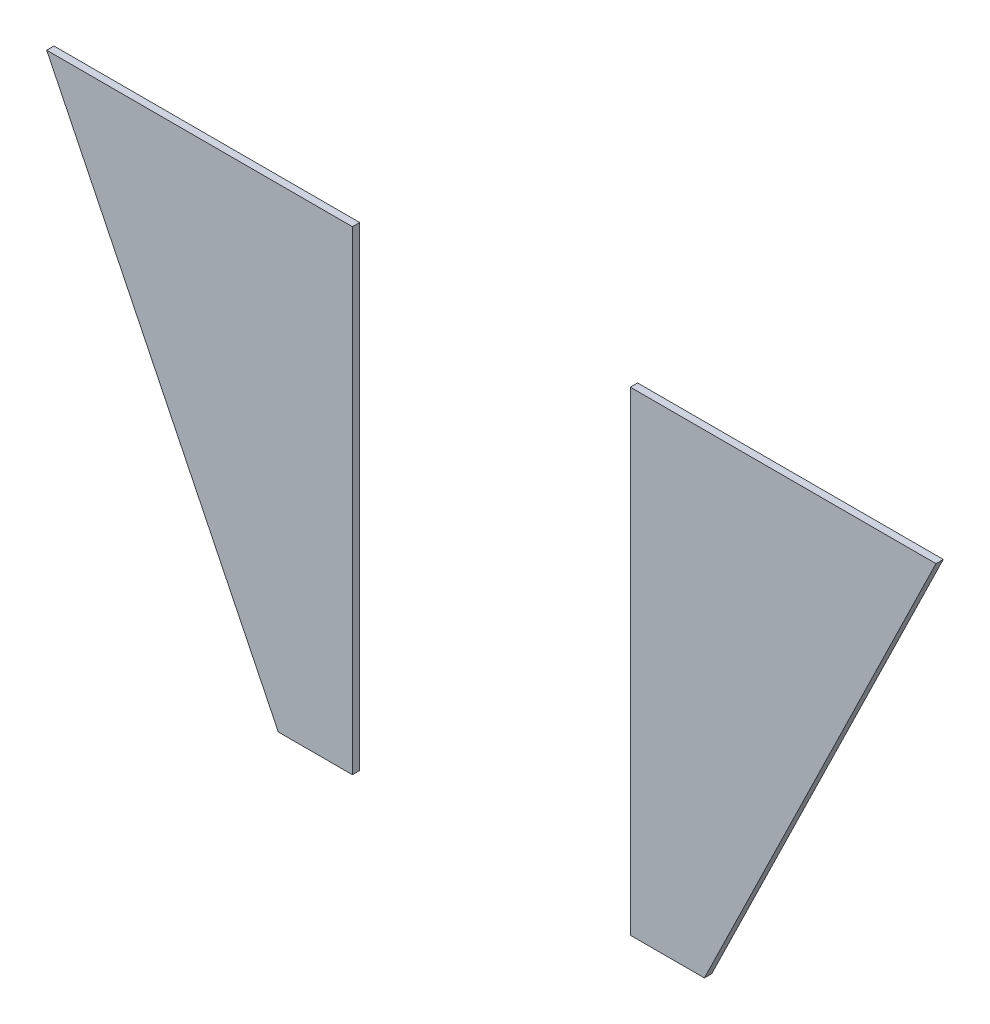
ISO-10303-21;
HEADER;
FILE_DESCRIPTION(('STEP AP214'),'2;1');
FILE_NAME('part.step','',(''),(''),'','','');
FILE_SCHEMA(('AUTOMOTIVE_DESIGN { 1 0 10303 214 1 1 1 1 }'));
ENDSEC;
DATA;
#1=APPLICATION_CONTEXT('core data for automotive mechanical design processes');
#2=APPLICATION_PROTOCOL_DEFINITION('international standard','automotive_design',2000,#1);
#3=PRODUCT_CONTEXT('',#1,'mechanical');
#4=PRODUCT('Part','Part','',(#3));
#5=PRODUCT_RELATED_PRODUCT_CATEGORY('part','',(#4));
#6=PRODUCT_DEFINITION_FORMATION('','',#4);
#7=PRODUCT_DEFINITION_CONTEXT('part definition',#1,'design');
#8=PRODUCT_DEFINITION('design','',#6,#7);
#9=PRODUCT_DEFINITION_SHAPE('','',#8);
#10=(LENGTH_UNIT() NAMED_UNIT(*) SI_UNIT(.MILLI.,.METRE.));
#11=(NAMED_UNIT(*) PLANE_ANGLE_UNIT() SI_UNIT($,.RADIAN.));
#12=(NAMED_UNIT(*) SI_UNIT($,.STERADIAN.) SOLID_ANGLE_UNIT());
#13=UNCERTAINTY_MEASURE_WITH_UNIT(LENGTH_MEASURE(1.E-05),#10,'distance_accuracy_value','');
#14=(GEOMETRIC_REPRESENTATION_CONTEXT(3) GLOBAL_UNCERTAINTY_ASSIGNED_CONTEXT((#13)) GLOBAL_UNIT_ASSIGNED_CONTEXT((#10,
#11,#12)) REPRESENTATION_CONTEXT('',''));
#15=CARTESIAN_POINT('',(0.,0.,0.));
#16=DIRECTION('',(0.,0.,1.));
#17=DIRECTION('',(1.,0.,0.));
#18=AXIS2_PLACEMENT_3D('',#15,#16,#17);
#19=CARTESIAN_POINT('',(92.9427180443167,2.88597765364185,5.));
#20=DIRECTION('',(0.89873260456614,0.438497098610427,0.));
#21=DIRECTION('',(-0.438497098610427,0.89873260456614,0.));
#22=AXIS2_PLACEMENT_3D('',#19,#20,#21);
#23=PLANE('',#22);
#24=DIRECTION('',(0.438497098610427,-0.89873260456614,0.));
#25=VECTOR('',#24,1.);
#26=CARTESIAN_POINT('',(92.9427180443167,2.88597765364185,0.));
#27=LINE('',#26,#25);
#28=CARTESIAN_POINT('',(-65.8072819556834,328.255977653642,0.));
#29=VERTEX_POINT('',#28);
#30=CARTESIAN_POINT('',(92.9427180443167,2.88597765364185,0.));
#31=VERTEX_POINT('',#30);
#32=EDGE_CURVE('E106',#29,#31,#27,.T.);
#33=ORIENTED_EDGE('',*,*,#32,.T.);
#34=DIRECTION('',(0.,0.,-1.));
#35=VECTOR('',#34,1.);
#36=CARTESIAN_POINT('',(92.9427180443167,2.88597765364185,5.));
#37=LINE('',#36,#35);
#38=CARTESIAN_POINT('',(92.9427180443167,2.88597765364185,5.));
#39=VERTEX_POINT('',#38);
#40=EDGE_CURVE('E12',#39,#31,#37,.T.);
#41=ORIENTED_EDGE('',*,*,#40,.F.);
#42=DIRECTION('',(0.438497098610427,-0.89873260456614,0.));
#43=VECTOR('',#42,1.);
#44=CARTESIAN_POINT('',(92.9427180443167,2.88597765364185,5.));
#45=LINE('',#44,#43);
#46=CARTESIAN_POINT('',(-65.8072819556834,328.255977653642,5.));
#47=VERTEX_POINT('',#46);
#48=EDGE_CURVE('E94',#47,#39,#45,.T.);
#49=ORIENTED_EDGE('',*,*,#48,.F.);
#50=DIRECTION('',(0.,0.,-1.));
#51=VECTOR('',#50,1.);
#52=CARTESIAN_POINT('',(-65.8072819556834,328.255977653642,5.));
#53=LINE('',#52,#51);
#54=EDGE_CURVE('E102',#47,#29,#53,.T.);
#55=ORIENTED_EDGE('',*,*,#54,.T.);
#56=EDGE_LOOP('',(#33,#41,#49,#55));
#57=FACE_BOUND('',#56,.T.);
#58=ADVANCED_FACE('F43',(#57),#23,.F.);
#59=CARTESIAN_POINT('',(92.9427180443167,2.88597765364185,5.));
#60=DIRECTION('',(0.,1.,0.));
#61=DIRECTION('',(0.,0.,1.));
#62=AXIS2_PLACEMENT_3D('',#59,#60,#61);
#63=PLANE('',#62);
#64=DIRECTION('',(1.,0.,0.));
#65=VECTOR('',#64,1.);
#66=CARTESIAN_POINT('',(92.9427180443167,2.88597765364185,0.));
#67=LINE('',#66,#65);
#68=CARTESIAN_POINT('',(143.742718044317,2.88597765364185,0.));
#69=VERTEX_POINT('',#68);
#70=EDGE_CURVE('E98',#31,#69,#67,.T.);
#71=ORIENTED_EDGE('',*,*,#70,.T.);
#72=DIRECTION('',(0.,0.,-1.));
#73=VECTOR('',#72,1.);
#74=CARTESIAN_POINT('',(143.742718044317,2.88597765364185,5.));
#75=LINE('',#74,#73);
#76=CARTESIAN_POINT('',(143.742718044317,2.88597765364185,5.));
#77=VERTEX_POINT('',#76);
#78=EDGE_CURVE('E51',#77,#69,#75,.T.);
#79=ORIENTED_EDGE('',*,*,#78,.F.);
#80=DIRECTION('',(1.,0.,0.));
#81=VECTOR('',#80,1.);
#82=CARTESIAN_POINT('',(92.9427180443167,2.88597765364185,5.));
#83=LINE('',#82,#81);
#84=EDGE_CURVE('E89',#39,#77,#83,.T.);
#85=ORIENTED_EDGE('',*,*,#84,.F.);
#86=ORIENTED_EDGE('',*,*,#40,.T.);
#87=EDGE_LOOP('',(#71,#79,#85,#86));
#88=FACE_BOUND('',#87,.T.);
#89=ADVANCED_FACE('F97',(#88),#63,.F.);
#90=CARTESIAN_POINT('',(143.742718044317,328.255977653642,5.));
#91=DIRECTION('',(-1.,0.,0.));
#92=DIRECTION('',(0.,-1.,0.));
#93=AXIS2_PLACEMENT_3D('',#90,#91,#92);
#94=PLANE('',#93);
#95=DIRECTION('',(0.,1.,0.));
#96=VECTOR('',#95,1.);
#97=CARTESIAN_POINT('',(143.742718044317,328.255977653642,0.));
#98=LINE('',#97,#96);
#99=CARTESIAN_POINT('',(143.742718044317,328.255977653642,0.));
#100=VERTEX_POINT('',#99);
#101=EDGE_CURVE('E76',#69,#100,#98,.T.);
#102=ORIENTED_EDGE('',*,*,#101,.T.);
#103=DIRECTION('',(0.,0.,-1.));
#104=VECTOR('',#103,1.);
#105=CARTESIAN_POINT('',(143.742718044317,328.255977653642,5.));
#106=LINE('',#105,#104);
#107=CARTESIAN_POINT('',(143.742718044317,328.255977653642,5.));
#108=VERTEX_POINT('',#107);
#109=EDGE_CURVE('E99',#108,#100,#106,.T.);
#110=ORIENTED_EDGE('',*,*,#109,.F.);
#111=DIRECTION('',(0.,1.,0.));
#112=VECTOR('',#111,1.);
#113=CARTESIAN_POINT('',(143.742718044317,328.255977653642,5.));
#114=LINE('',#113,#112);
#115=EDGE_CURVE('E92',#77,#108,#114,.T.);
#116=ORIENTED_EDGE('',*,*,#115,.F.);
#117=ORIENTED_EDGE('',*,*,#78,.T.);
#118=EDGE_LOOP('',(#102,#110,#116,#117));
#119=FACE_BOUND('',#118,.T.);
#120=ADVANCED_FACE('F100',(#119),#94,.F.);
#121=CARTESIAN_POINT('',(-65.8072819556834,328.255977653642,5.));
#122=DIRECTION('',(0.,-1.,0.));
#123=DIRECTION('',(0.,0.,-1.));
#124=AXIS2_PLACEMENT_3D('',#121,#122,#123);
#125=PLANE('',#124);
#126=DIRECTION('',(-1.,0.,0.));
#127=VECTOR('',#126,1.);
#128=CARTESIAN_POINT('',(-65.8072819556834,328.255977653642,0.));
#129=LINE('',#128,#127);
#130=EDGE_CURVE('E82',#100,#29,#129,.T.);
#131=ORIENTED_EDGE('',*,*,#130,.T.);
#132=ORIENTED_EDGE('',*,*,#54,.F.);
#133=DIRECTION('',(-1.,0.,0.));
#134=VECTOR('',#133,1.);
#135=CARTESIAN_POINT('',(-65.8072819556834,328.255977653642,5.));
#136=LINE('',#135,#134);
#137=EDGE_CURVE('E59',#108,#47,#136,.T.);
#138=ORIENTED_EDGE('',*,*,#137,.F.);
#139=ORIENTED_EDGE('',*,*,#109,.T.);
#140=EDGE_LOOP('',(#131,#132,#138,#139));
#141=FACE_BOUND('',#140,.T.);
#142=ADVANCED_FACE('F113',(#141),#125,.F.);
#143=CARTESIAN_POINT('',(0.,0.,5.));
#144=DIRECTION('',(0.,0.,-1.));
#145=DIRECTION('',(-1.,0.,0.));
#146=AXIS2_PLACEMENT_3D('',#143,#144,#145);
#147=PLANE('',#146);
#148=ORIENTED_EDGE('',*,*,#48,.T.);
#149=ORIENTED_EDGE('',*,*,#84,.T.);
#150=ORIENTED_EDGE('',*,*,#115,.T.);
#151=ORIENTED_EDGE('',*,*,#137,.T.);
#152=EDGE_LOOP('',(#148,#149,#150,#151));
#153=FACE_BOUND('',#152,.T.);
#154=ADVANCED_FACE('F90',(#153),#147,.F.);
#155=CARTESIAN_POINT('',(0.,0.,0.));
#156=DIRECTION('',(0.,0.,-1.));
#157=DIRECTION('',(-1.,0.,0.));
#158=AXIS2_PLACEMENT_3D('',#155,#156,#157);
#159=PLANE('',#158);
#160=ORIENTED_EDGE('',*,*,#32,.F.);
#161=ORIENTED_EDGE('',*,*,#130,.F.);
#162=ORIENTED_EDGE('',*,*,#101,.F.);
#163=ORIENTED_EDGE('',*,*,#70,.F.);
#164=EDGE_LOOP('',(#160,#161,#162,#163));
#165=FACE_BOUND('',#164,.T.);
#166=ADVANCED_FACE('F116',(#165),#159,.T.);
#167=CLOSED_SHELL('',(#58,#89,#120,#142,#154,#166));
#168=MANIFOLD_SOLID_BREP('B2',#167);
#169=CARTESIAN_POINT('',(543.792718044317,328.255977653642,5.));
#170=DIRECTION('',(0.,-1.,0.));
#171=DIRECTION('',(0.,0.,-1.));
#172=AXIS2_PLACEMENT_3D('',#169,#170,#171);
#173=PLANE('',#172);
#174=DIRECTION('',(-1.,0.,0.));
#175=VECTOR('',#174,1.);
#176=CARTESIAN_POINT('',(543.792718044317,328.255977653642,0.));
#177=LINE('',#176,#175);
#178=CARTESIAN_POINT('',(543.792718044317,328.255977653642,0.));
#179=VERTEX_POINT('',#178);
#180=CARTESIAN_POINT('',(334.242718044317,328.255977653642,0.));
#181=VERTEX_POINT('',#180);
#182=EDGE_CURVE('E230',#179,#181,#177,.T.);
#183=ORIENTED_EDGE('',*,*,#182,.T.);
#184=DIRECTION('',(0.,0.,-1.));
#185=VECTOR('',#184,1.);
#186=CARTESIAN_POINT('',(334.242718044317,328.255977653642,5.));
#187=LINE('',#186,#185);
#188=CARTESIAN_POINT('',(334.242718044317,328.255977653642,5.));
#189=VERTEX_POINT('',#188);
#190=EDGE_CURVE('E41',#189,#181,#187,.T.);
#191=ORIENTED_EDGE('',*,*,#190,.F.);
#192=DIRECTION('',(-1.,0.,0.));
#193=VECTOR('',#192,1.);
#194=CARTESIAN_POINT('',(543.792718044317,328.255977653642,5.));
#195=LINE('',#194,#193);
#196=CARTESIAN_POINT('',(543.792718044317,328.255977653642,5.));
#197=VERTEX_POINT('',#196);
#198=EDGE_CURVE('E218',#197,#189,#195,.T.);
#199=ORIENTED_EDGE('',*,*,#198,.F.);
#200=DIRECTION('',(0.,0.,-1.));
#201=VECTOR('',#200,1.);
#202=CARTESIAN_POINT('',(543.792718044317,328.255977653642,5.));
#203=LINE('',#202,#201);
#204=EDGE_CURVE('E226',#197,#179,#203,.T.);
#205=ORIENTED_EDGE('',*,*,#204,.T.);
#206=EDGE_LOOP('',(#183,#191,#199,#205));
#207=FACE_BOUND('',#206,.T.);
#208=ADVANCED_FACE('F167',(#207),#173,.F.);
#209=CARTESIAN_POINT('',(334.242718044317,328.255977653642,5.));
#210=DIRECTION('',(1.,0.,0.));
#211=DIRECTION('',(0.,1.,0.));
#212=AXIS2_PLACEMENT_3D('',#209,#210,#211);
#213=PLANE('',#212);
#214=DIRECTION('',(0.,-1.,0.));
#215=VECTOR('',#214,1.);
#216=CARTESIAN_POINT('',(334.242718044317,328.255977653642,0.));
#217=LINE('',#216,#215);
#218=CARTESIAN_POINT('',(334.242718044317,2.88597765364185,0.));
#219=VERTEX_POINT('',#218);
#220=EDGE_CURVE('E222',#181,#219,#217,.T.);
#221=ORIENTED_EDGE('',*,*,#220,.T.);
#222=DIRECTION('',(0.,0.,-1.));
#223=VECTOR('',#222,1.);
#224=CARTESIAN_POINT('',(334.242718044317,2.88597765364185,5.));
#225=LINE('',#224,#223);
#226=CARTESIAN_POINT('',(334.242718044317,2.88597765364185,5.));
#227=VERTEX_POINT('',#226);
#228=EDGE_CURVE('E175',#227,#219,#225,.T.);
#229=ORIENTED_EDGE('',*,*,#228,.F.);
#230=DIRECTION('',(0.,-1.,0.));
#231=VECTOR('',#230,1.);
#232=CARTESIAN_POINT('',(334.242718044317,328.255977653642,5.));
#233=LINE('',#232,#231);
#234=EDGE_CURVE('E213',#189,#227,#233,.T.);
#235=ORIENTED_EDGE('',*,*,#234,.F.);
#236=ORIENTED_EDGE('',*,*,#190,.T.);
#237=EDGE_LOOP('',(#221,#229,#235,#236));
#238=FACE_BOUND('',#237,.T.);
#239=ADVANCED_FACE('F221',(#238),#213,.F.);
#240=CARTESIAN_POINT('',(385.042718044317,2.88597765364185,5.));
#241=DIRECTION('',(0.,1.,0.));
#242=DIRECTION('',(0.,0.,1.));
#243=AXIS2_PLACEMENT_3D('',#240,#241,#242);
#244=PLANE('',#243);
#245=DIRECTION('',(1.,0.,0.));
#246=VECTOR('',#245,1.);
#247=CARTESIAN_POINT('',(385.042718044317,2.88597765364185,0.));
#248=LINE('',#247,#246);
#249=CARTESIAN_POINT('',(385.042718044317,2.88597765364185,0.));
#250=VERTEX_POINT('',#249);
#251=EDGE_CURVE('E200',#219,#250,#248,.T.);
#252=ORIENTED_EDGE('',*,*,#251,.T.);
#253=DIRECTION('',(0.,0.,-1.));
#254=VECTOR('',#253,1.);
#255=CARTESIAN_POINT('',(385.042718044317,2.88597765364185,5.));
#256=LINE('',#255,#254);
#257=CARTESIAN_POINT('',(385.042718044317,2.88597765364185,5.));
#258=VERTEX_POINT('',#257);
#259=EDGE_CURVE('E223',#258,#250,#256,.T.);
#260=ORIENTED_EDGE('',*,*,#259,.F.);
#261=DIRECTION('',(1.,0.,0.));
#262=VECTOR('',#261,1.);
#263=CARTESIAN_POINT('',(385.042718044317,2.88597765364185,5.));
#264=LINE('',#263,#262);
#265=EDGE_CURVE('E216',#227,#258,#264,.T.);
#266=ORIENTED_EDGE('',*,*,#265,.F.);
#267=ORIENTED_EDGE('',*,*,#228,.T.);
#268=EDGE_LOOP('',(#252,#260,#266,#267));
#269=FACE_BOUND('',#268,.T.);
#270=ADVANCED_FACE('F224',(#269),#244,.F.);
#271=CARTESIAN_POINT('',(385.042718044317,2.88597765364185,5.));
#272=DIRECTION('',(-0.89873260456614,0.438497098610427,0.));
#273=DIRECTION('',(-0.438497098610427,-0.89873260456614,0.));
#274=AXIS2_PLACEMENT_3D('',#271,#272,#273);
#275=PLANE('',#274);
#276=DIRECTION('',(0.438497098610427,0.89873260456614,0.));
#277=VECTOR('',#276,1.);
#278=CARTESIAN_POINT('',(385.042718044317,2.88597765364185,0.));
#279=LINE('',#278,#277);
#280=EDGE_CURVE('E206',#250,#179,#279,.T.);
#281=ORIENTED_EDGE('',*,*,#280,.T.);
#282=ORIENTED_EDGE('',*,*,#204,.F.);
#283=DIRECTION('',(0.438497098610427,0.89873260456614,0.));
#284=VECTOR('',#283,1.);
#285=CARTESIAN_POINT('',(385.042718044317,2.88597765364185,5.));
#286=LINE('',#285,#284);
#287=EDGE_CURVE('E183',#258,#197,#286,.T.);
#288=ORIENTED_EDGE('',*,*,#287,.F.);
#289=ORIENTED_EDGE('',*,*,#259,.T.);
#290=EDGE_LOOP('',(#281,#282,#288,#289));
#291=FACE_BOUND('',#290,.T.);
#292=ADVANCED_FACE('F237',(#291),#275,.F.);
#293=CARTESIAN_POINT('',(0.,0.,5.));
#294=DIRECTION('',(0.,0.,1.));
#295=DIRECTION('',(1.,0.,0.));
#296=AXIS2_PLACEMENT_3D('',#293,#294,#295);
#297=PLANE('',#296);
#298=ORIENTED_EDGE('',*,*,#198,.T.);
#299=ORIENTED_EDGE('',*,*,#234,.T.);
#300=ORIENTED_EDGE('',*,*,#265,.T.);
#301=ORIENTED_EDGE('',*,*,#287,.T.);
#302=EDGE_LOOP('',(#298,#299,#300,#301));
#303=FACE_BOUND('',#302,.T.);
#304=ADVANCED_FACE('F214',(#303),#297,.T.);
#305=CARTESIAN_POINT('',(0.,0.,0.));
#306=DIRECTION('',(0.,0.,1.));
#307=DIRECTION('',(1.,0.,0.));
#308=AXIS2_PLACEMENT_3D('',#305,#306,#307);
#309=PLANE('',#308);
#310=ORIENTED_EDGE('',*,*,#182,.F.);
#311=ORIENTED_EDGE('',*,*,#280,.F.);
#312=ORIENTED_EDGE('',*,*,#251,.F.);
#313=ORIENTED_EDGE('',*,*,#220,.F.);
#314=EDGE_LOOP('',(#310,#311,#312,#313));
#315=FACE_BOUND('',#314,.T.);
#316=ADVANCED_FACE('F240',(#315),#309,.F.);
#317=CLOSED_SHELL('',(#208,#239,#270,#292,#304,#316));
#318=MANIFOLD_SOLID_BREP('B6',#317);
#319=ADVANCED_BREP_SHAPE_REPRESENTATION('',(#18,#168,#318),#14);
#320=SHAPE_DEFINITION_REPRESENTATION(#9,#319);
ENDSEC;
END-ISO-10303-21;
